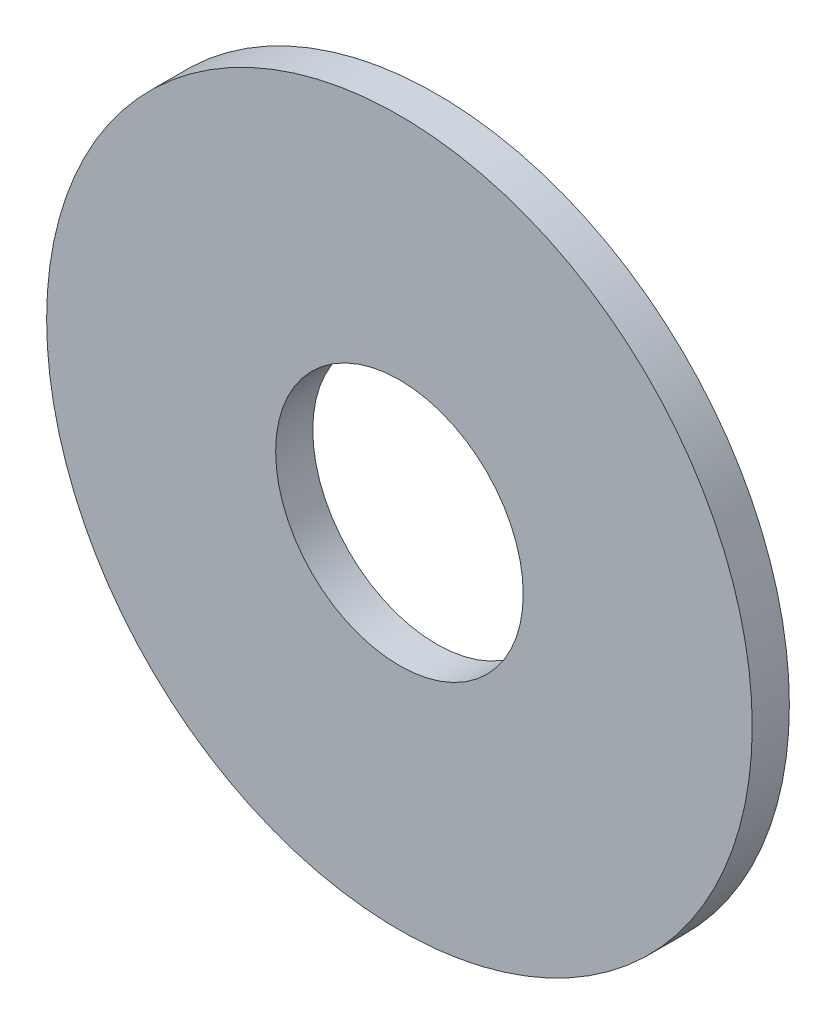
ISO-10303-21;
HEADER;
FILE_DESCRIPTION(('STEP AP214'),'2;1');
FILE_NAME('part.step','',(''),(''),'','','');
FILE_SCHEMA(('AUTOMOTIVE_DESIGN { 1 0 10303 214 1 1 1 1 }'));
ENDSEC;
DATA;
#1=APPLICATION_CONTEXT('core data for automotive mechanical design processes');
#2=APPLICATION_PROTOCOL_DEFINITION('international standard','automotive_design',2000,#1);
#3=PRODUCT_CONTEXT('',#1,'mechanical');
#4=PRODUCT('Part','Part','',(#3));
#5=PRODUCT_RELATED_PRODUCT_CATEGORY('part','',(#4));
#6=PRODUCT_DEFINITION_FORMATION('','',#4);
#7=PRODUCT_DEFINITION_CONTEXT('part definition',#1,'design');
#8=PRODUCT_DEFINITION('design','',#6,#7);
#9=PRODUCT_DEFINITION_SHAPE('','',#8);
#10=(LENGTH_UNIT() NAMED_UNIT(*) SI_UNIT(.MILLI.,.METRE.));
#11=(NAMED_UNIT(*) PLANE_ANGLE_UNIT() SI_UNIT($,.RADIAN.));
#12=(NAMED_UNIT(*) SI_UNIT($,.STERADIAN.) SOLID_ANGLE_UNIT());
#13=UNCERTAINTY_MEASURE_WITH_UNIT(LENGTH_MEASURE(1.E-05),#10,'distance_accuracy_value','');
#14=(GEOMETRIC_REPRESENTATION_CONTEXT(3) GLOBAL_UNCERTAINTY_ASSIGNED_CONTEXT((#13)) GLOBAL_UNIT_ASSIGNED_CONTEXT((#10,
#11,#12)) REPRESENTATION_CONTEXT('',''));
#15=CARTESIAN_POINT('',(0.,0.,0.));
#16=DIRECTION('',(0.,0.,1.));
#17=DIRECTION('',(1.,0.,0.));
#18=AXIS2_PLACEMENT_3D('',#15,#16,#17);
#19=CARTESIAN_POINT('',(0.,0.,-0.762));
#20=DIRECTION('',(0.,0.,1.));
#21=DIRECTION('',(1.,0.,0.));
#22=AXIS2_PLACEMENT_3D('',#19,#20,#21);
#23=CYLINDRICAL_SURFACE('',#22,7.239);
#24=CARTESIAN_POINT('',(0.,0.,-0.762));
#25=DIRECTION('',(0.,0.,1.));
#26=DIRECTION('',(1.,0.,0.));
#27=AXIS2_PLACEMENT_3D('',#24,#25,#26);
#28=CIRCLE('',#27,7.239);
#29=CARTESIAN_POINT('',(7.239,0.,-0.762));
#30=VERTEX_POINT('',#29);
#31=EDGE_CURVE('E10',#30,#30,#28,.T.);
#32=CARTESIAN_POINT('',(0.,0.,0.));
#33=DIRECTION('',(0.,0.,1.));
#34=DIRECTION('',(1.,0.,0.));
#35=AXIS2_PLACEMENT_3D('',#32,#33,#34);
#36=CIRCLE('',#35,7.239);
#37=CARTESIAN_POINT('',(7.239,0.,0.));
#38=VERTEX_POINT('',#37);
#39=EDGE_CURVE('E43',#38,#38,#36,.T.);
#40=CARTESIAN_POINT('',(7.239,0.,-0.762));
#41=CARTESIAN_POINT('',(7.239,0.,-0.7540625));
#42=CARTESIAN_POINT('',(7.239,0.,-0.746125));
#43=CARTESIAN_POINT('',(7.239,0.,-0.73025));
#44=CARTESIAN_POINT('',(7.239,0.,-0.7223125));
#45=CARTESIAN_POINT('',(7.239,0.,-0.7064375));
#46=CARTESIAN_POINT('',(7.239,0.,-0.6985));
#47=CARTESIAN_POINT('',(7.239,0.,-0.682625));
#48=CARTESIAN_POINT('',(7.239,0.,-0.6746875));
#49=CARTESIAN_POINT('',(7.239,0.,-0.6588125));
#50=CARTESIAN_POINT('',(7.239,0.,-0.650875));
#51=CARTESIAN_POINT('',(7.239,0.,-0.635));
#52=CARTESIAN_POINT('',(7.239,0.,-0.6270625));
#53=CARTESIAN_POINT('',(7.239,0.,-0.6111875));
#54=CARTESIAN_POINT('',(7.239,0.,-0.60325));
#55=CARTESIAN_POINT('',(7.239,0.,-0.587375));
#56=CARTESIAN_POINT('',(7.239,0.,-0.5794375));
#57=CARTESIAN_POINT('',(7.239,0.,-0.5635625));
#58=CARTESIAN_POINT('',(7.239,0.,-0.555625));
#59=CARTESIAN_POINT('',(7.239,0.,-0.53975));
#60=CARTESIAN_POINT('',(7.239,0.,-0.5318125));
#61=CARTESIAN_POINT('',(7.239,0.,-0.5159375));
#62=CARTESIAN_POINT('',(7.239,0.,-0.508));
#63=CARTESIAN_POINT('',(7.239,0.,-0.492125));
#64=CARTESIAN_POINT('',(7.239,0.,-0.4841875));
#65=CARTESIAN_POINT('',(7.239,0.,-0.4683125));
#66=CARTESIAN_POINT('',(7.239,0.,-0.460375));
#67=CARTESIAN_POINT('',(7.239,0.,-0.4445));
#68=CARTESIAN_POINT('',(7.239,0.,-0.4365625));
#69=CARTESIAN_POINT('',(7.239,0.,-0.4206875));
#70=CARTESIAN_POINT('',(7.239,0.,-0.41275));
#71=CARTESIAN_POINT('',(7.239,0.,-0.396875));
#72=CARTESIAN_POINT('',(7.239,0.,-0.3889375));
#73=CARTESIAN_POINT('',(7.239,0.,-0.3730625));
#74=CARTESIAN_POINT('',(7.239,0.,-0.365125));
#75=CARTESIAN_POINT('',(7.239,0.,-0.34925));
#76=CARTESIAN_POINT('',(7.239,0.,-0.3413125));
#77=CARTESIAN_POINT('',(7.239,0.,-0.3254375));
#78=CARTESIAN_POINT('',(7.239,0.,-0.3175));
#79=CARTESIAN_POINT('',(7.239,0.,-0.301625));
#80=CARTESIAN_POINT('',(7.239,0.,-0.2936875));
#81=CARTESIAN_POINT('',(7.239,0.,-0.2778125));
#82=CARTESIAN_POINT('',(7.239,0.,-0.269875));
#83=CARTESIAN_POINT('',(7.239,0.,-0.254));
#84=CARTESIAN_POINT('',(7.239,0.,-0.2460625));
#85=CARTESIAN_POINT('',(7.239,0.,-0.2301875));
#86=CARTESIAN_POINT('',(7.239,0.,-0.22225));
#87=CARTESIAN_POINT('',(7.239,0.,-0.206375));
#88=CARTESIAN_POINT('',(7.239,0.,-0.1984375));
#89=CARTESIAN_POINT('',(7.239,0.,-0.1825625));
#90=CARTESIAN_POINT('',(7.239,0.,-0.174625));
#91=CARTESIAN_POINT('',(7.239,0.,-0.15875));
#92=CARTESIAN_POINT('',(7.239,0.,-0.1508125));
#93=CARTESIAN_POINT('',(7.239,0.,-0.1349375));
#94=CARTESIAN_POINT('',(7.239,0.,-0.127));
#95=CARTESIAN_POINT('',(7.239,0.,-0.111125));
#96=CARTESIAN_POINT('',(7.239,0.,-0.1031875));
#97=CARTESIAN_POINT('',(7.239,0.,-0.0873125));
#98=CARTESIAN_POINT('',(7.239,0.,-0.079375));
#99=CARTESIAN_POINT('',(7.239,0.,-0.0635));
#100=CARTESIAN_POINT('',(7.239,0.,-0.0555625));
#101=CARTESIAN_POINT('',(7.239,0.,-0.0396875));
#102=CARTESIAN_POINT('',(7.239,0.,-0.03175));
#103=CARTESIAN_POINT('',(7.239,0.,-0.015875));
#104=CARTESIAN_POINT('',(7.239,0.,-0.00793749999999999));
#105=CARTESIAN_POINT('',(7.239,0.,0.));
#106=B_SPLINE_CURVE_WITH_KNOTS('',3,(#40,#41,#42,#43,#44,#45,#46,#47,#48,#49,#50,#51,#52,#53,
#54,#55,#56,#57,#58,#59,#60,#61,#62,#63,#64,#65,#66,#67,#68,#69,#70,#71,#72,#73,#74,#75,#76,#77,
#78,#79,#80,#81,#82,#83,#84,#85,#86,#87,#88,#89,#90,#91,#92,#93,#94,#95,#96,#97,#98,#99,#100,
#101,#102,#103,#104,#105),.UNSPECIFIED.,.F.,.F.,(4,2,2,2,2,2,2,2,2,2,2,2,2,2,2,2,2,2,2,2,2,2,2,
2,2,2,2,2,2,2,2,2,4),(0.,0.0238125,0.0476249999999999,0.0714375,0.09525,0.1190625,0.142875,
0.1666875,0.1905,0.2143125,0.238125,0.2619375,0.28575,0.3095625,0.333375,0.3571875,0.381,
0.4048125,0.428625,0.4524375,0.47625,0.5000625,0.523875,0.5476875,0.5715,0.5953125,0.619125,
0.6429375,0.66675,0.6905625,0.714375,0.7381875,0.762),.UNSPECIFIED.);
#107=EDGE_CURVE('BSEAM40',#30,#38,#106,.T.);
#108=ORIENTED_EDGE('',*,*,#31,.T.);
#109=ORIENTED_EDGE('',*,*,#39,.F.);
#110=ORIENTED_EDGE('',*,*,#107,.T.);
#111=ORIENTED_EDGE('',*,*,#107,.F.);
#112=EDGE_LOOP('',(#108,#110,#109,#111));
#113=FACE_BOUND('',#112,.T.);
#114=ADVANCED_FACE('F40',(#113),#23,.T.);
#115=CARTESIAN_POINT('',(0.,0.,-0.762));
#116=DIRECTION('',(0.,0.,1.));
#117=DIRECTION('',(1.,0.,0.));
#118=AXIS2_PLACEMENT_3D('',#115,#116,#117);
#119=PLANE('',#118);
#120=CARTESIAN_POINT('',(0.,0.,-0.762));
#121=DIRECTION('',(0.,0.,1.));
#122=DIRECTION('',(1.,0.,0.));
#123=AXIS2_PLACEMENT_3D('',#120,#121,#122);
#124=CIRCLE('',#123,2.54);
#125=CARTESIAN_POINT('',(2.54,0.,-0.762));
#126=VERTEX_POINT('',#125);
#127=EDGE_CURVE('E52',#126,#126,#124,.T.);
#128=ORIENTED_EDGE('',*,*,#127,.T.);
#129=EDGE_LOOP('',(#128));
#130=FACE_BOUND('',#129,.T.);
#131=ORIENTED_EDGE('',*,*,#31,.F.);
#132=EDGE_LOOP('',(#131));
#133=FACE_BOUND('',#132,.T.);
#134=ADVANCED_FACE('F62',(#130,#133),#119,.F.);
#135=CARTESIAN_POINT('',(0.,0.,0.));
#136=DIRECTION('',(0.,0.,1.));
#137=DIRECTION('',(1.,0.,0.));
#138=AXIS2_PLACEMENT_3D('',#135,#136,#137);
#139=PLANE('',#138);
#140=CARTESIAN_POINT('',(0.,0.,0.));
#141=DIRECTION('',(0.,0.,1.));
#142=DIRECTION('',(1.,0.,0.));
#143=AXIS2_PLACEMENT_3D('',#140,#141,#142);
#144=CIRCLE('',#143,2.54);
#145=CARTESIAN_POINT('',(2.54,0.,0.));
#146=VERTEX_POINT('',#145);
#147=EDGE_CURVE('E54',#146,#146,#144,.T.);
#148=ORIENTED_EDGE('',*,*,#147,.F.);
#149=EDGE_LOOP('',(#148));
#150=FACE_BOUND('',#149,.T.);
#151=ORIENTED_EDGE('',*,*,#39,.T.);
#152=EDGE_LOOP('',(#151));
#153=FACE_BOUND('',#152,.T.);
#154=ADVANCED_FACE('F68',(#150,#153),#139,.T.);
#155=CARTESIAN_POINT('',(0.,0.,-0.762));
#156=DIRECTION('',(0.,0.,1.));
#157=DIRECTION('',(1.,0.,0.));
#158=AXIS2_PLACEMENT_3D('',#155,#156,#157);
#159=CYLINDRICAL_SURFACE('',#158,2.54);
#160=CARTESIAN_POINT('',(2.54,0.,-0.762));
#161=CARTESIAN_POINT('',(2.54,0.,-0.7540625));
#162=CARTESIAN_POINT('',(2.54,0.,-0.746125));
#163=CARTESIAN_POINT('',(2.54,0.,-0.73025));
#164=CARTESIAN_POINT('',(2.54,0.,-0.7223125));
#165=CARTESIAN_POINT('',(2.54,0.,-0.7064375));
#166=CARTESIAN_POINT('',(2.54,0.,-0.6985));
#167=CARTESIAN_POINT('',(2.54,0.,-0.682625));
#168=CARTESIAN_POINT('',(2.54,0.,-0.6746875));
#169=CARTESIAN_POINT('',(2.54,0.,-0.6588125));
#170=CARTESIAN_POINT('',(2.54,0.,-0.650875));
#171=CARTESIAN_POINT('',(2.54,0.,-0.635));
#172=CARTESIAN_POINT('',(2.54,0.,-0.6270625));
#173=CARTESIAN_POINT('',(2.54,0.,-0.6111875));
#174=CARTESIAN_POINT('',(2.54,0.,-0.60325));
#175=CARTESIAN_POINT('',(2.54,0.,-0.587375));
#176=CARTESIAN_POINT('',(2.54,0.,-0.5794375));
#177=CARTESIAN_POINT('',(2.54,0.,-0.5635625));
#178=CARTESIAN_POINT('',(2.54,0.,-0.555625));
#179=CARTESIAN_POINT('',(2.54,0.,-0.53975));
#180=CARTESIAN_POINT('',(2.54,0.,-0.5318125));
#181=CARTESIAN_POINT('',(2.54,0.,-0.5159375));
#182=CARTESIAN_POINT('',(2.54,0.,-0.508));
#183=CARTESIAN_POINT('',(2.54,0.,-0.492125));
#184=CARTESIAN_POINT('',(2.54,0.,-0.4841875));
#185=CARTESIAN_POINT('',(2.54,0.,-0.4683125));
#186=CARTESIAN_POINT('',(2.54,0.,-0.460375));
#187=CARTESIAN_POINT('',(2.54,0.,-0.4445));
#188=CARTESIAN_POINT('',(2.54,0.,-0.4365625));
#189=CARTESIAN_POINT('',(2.54,0.,-0.4206875));
#190=CARTESIAN_POINT('',(2.54,0.,-0.41275));
#191=CARTESIAN_POINT('',(2.54,0.,-0.396875));
#192=CARTESIAN_POINT('',(2.54,0.,-0.3889375));
#193=CARTESIAN_POINT('',(2.54,0.,-0.3730625));
#194=CARTESIAN_POINT('',(2.54,0.,-0.365125));
#195=CARTESIAN_POINT('',(2.54,0.,-0.34925));
#196=CARTESIAN_POINT('',(2.54,0.,-0.3413125));
#197=CARTESIAN_POINT('',(2.54,0.,-0.3254375));
#198=CARTESIAN_POINT('',(2.54,0.,-0.3175));
#199=CARTESIAN_POINT('',(2.54,0.,-0.301625));
#200=CARTESIAN_POINT('',(2.54,0.,-0.2936875));
#201=CARTESIAN_POINT('',(2.54,0.,-0.2778125));
#202=CARTESIAN_POINT('',(2.54,0.,-0.269875));
#203=CARTESIAN_POINT('',(2.54,0.,-0.254));
#204=CARTESIAN_POINT('',(2.54,0.,-0.2460625));
#205=CARTESIAN_POINT('',(2.54,0.,-0.2301875));
#206=CARTESIAN_POINT('',(2.54,0.,-0.22225));
#207=CARTESIAN_POINT('',(2.54,0.,-0.206375));
#208=CARTESIAN_POINT('',(2.54,0.,-0.1984375));
#209=CARTESIAN_POINT('',(2.54,0.,-0.1825625));
#210=CARTESIAN_POINT('',(2.54,0.,-0.174625));
#211=CARTESIAN_POINT('',(2.54,0.,-0.15875));
#212=CARTESIAN_POINT('',(2.54,0.,-0.1508125));
#213=CARTESIAN_POINT('',(2.54,0.,-0.1349375));
#214=CARTESIAN_POINT('',(2.54,0.,-0.127));
#215=CARTESIAN_POINT('',(2.54,0.,-0.111125));
#216=CARTESIAN_POINT('',(2.54,0.,-0.1031875));
#217=CARTESIAN_POINT('',(2.54,0.,-0.0873125));
#218=CARTESIAN_POINT('',(2.54,0.,-0.079375));
#219=CARTESIAN_POINT('',(2.54,0.,-0.0635));
#220=CARTESIAN_POINT('',(2.54,0.,-0.0555625));
#221=CARTESIAN_POINT('',(2.54,0.,-0.0396875));
#222=CARTESIAN_POINT('',(2.54,0.,-0.03175));
#223=CARTESIAN_POINT('',(2.54,0.,-0.015875));
#224=CARTESIAN_POINT('',(2.54,0.,-0.00793749999999999));
#225=CARTESIAN_POINT('',(2.54,0.,0.));
#226=B_SPLINE_CURVE_WITH_KNOTS('',3,(#160,#161,#162,#163,#164,#165,#166,#167,#168,#169,#170,
#171,#172,#173,#174,#175,#176,#177,#178,#179,#180,#181,#182,#183,#184,#185,#186,#187,#188,#189,
#190,#191,#192,#193,#194,#195,#196,#197,#198,#199,#200,#201,#202,#203,#204,#205,#206,#207,#208,
#209,#210,#211,#212,#213,#214,#215,#216,#217,#218,#219,#220,#221,#222,#223,#224,#225),
.UNSPECIFIED.,.F.,.F.,(4,2,2,2,2,2,2,2,2,2,2,2,2,2,2,2,2,2,2,2,2,2,2,2,2,2,2,2,2,2,2,2,4),(0.,
0.0238125000000001,0.047625,0.0714375000000001,0.0952500000000001,0.1190625,0.142875,0.1666875,
0.1905,0.2143125,0.238125,0.2619375,0.28575,0.3095625,0.333375,0.3571875,0.381,0.4048125,
0.428625,0.4524375,0.47625,0.5000625,0.523875,0.5476875,0.5715,0.5953125,0.619125,0.6429375,
0.66675,0.6905625,0.714375,0.7381875,0.762),.UNSPECIFIED.);
#227=EDGE_CURVE('BSEAM65',#126,#146,#226,.T.);
#228=ORIENTED_EDGE('',*,*,#127,.F.);
#229=ORIENTED_EDGE('',*,*,#147,.T.);
#230=ORIENTED_EDGE('',*,*,#227,.T.);
#231=ORIENTED_EDGE('',*,*,#227,.F.);
#232=EDGE_LOOP('',(#228,#230,#229,#231));
#233=FACE_BOUND('',#232,.T.);
#234=ADVANCED_FACE('F65',(#233),#159,.F.);
#235=CLOSED_SHELL('',(#114,#134,#154,#234));
#236=MANIFOLD_SOLID_BREP('B2',#235);
#237=ADVANCED_BREP_SHAPE_REPRESENTATION('',(#18,#236),#14);
#238=SHAPE_DEFINITION_REPRESENTATION(#9,#237);
ENDSEC;
END-ISO-10303-21;
